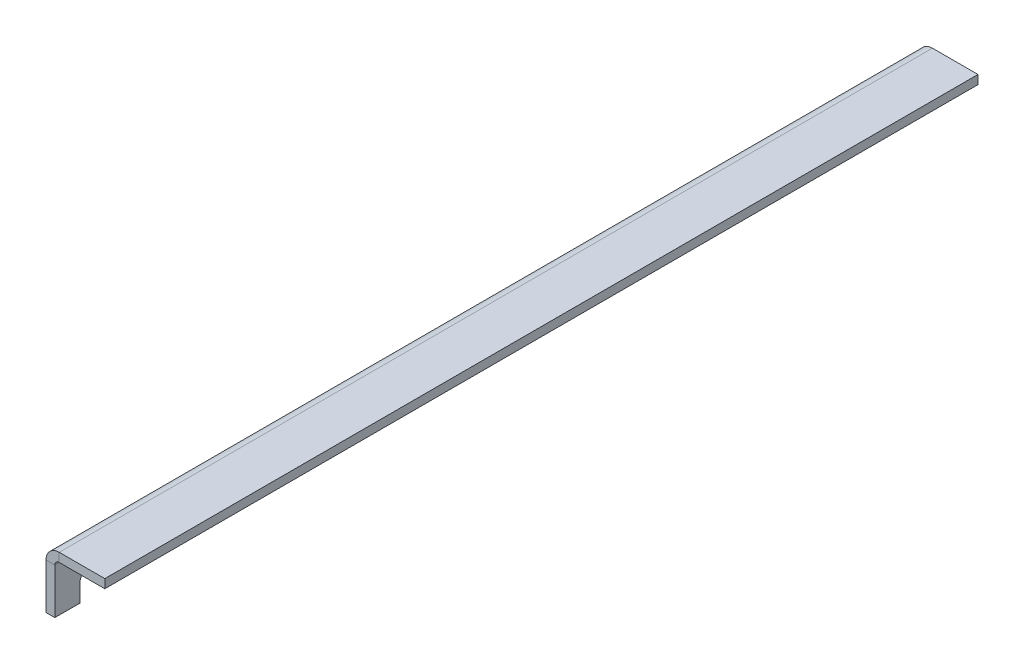
ISO-10303-21;
HEADER;
FILE_DESCRIPTION(('STEP AP214'),'2;1');
FILE_NAME('part.step','',(''),(''),'','','');
FILE_SCHEMA(('AUTOMOTIVE_DESIGN { 1 0 10303 214 1 1 1 1 }'));
ENDSEC;
DATA;
#1=APPLICATION_CONTEXT('core data for automotive mechanical design processes');
#2=APPLICATION_PROTOCOL_DEFINITION('international standard','automotive_design',2000,#1);
#3=PRODUCT_CONTEXT('',#1,'mechanical');
#4=PRODUCT('Part','Part','',(#3));
#5=PRODUCT_RELATED_PRODUCT_CATEGORY('part','',(#4));
#6=PRODUCT_DEFINITION_FORMATION('','',#4);
#7=PRODUCT_DEFINITION_CONTEXT('part definition',#1,'design');
#8=PRODUCT_DEFINITION('design','',#6,#7);
#9=PRODUCT_DEFINITION_SHAPE('','',#8);
#10=(LENGTH_UNIT() NAMED_UNIT(*) SI_UNIT(.MILLI.,.METRE.));
#11=(NAMED_UNIT(*) PLANE_ANGLE_UNIT() SI_UNIT($,.RADIAN.));
#12=(NAMED_UNIT(*) SI_UNIT($,.STERADIAN.) SOLID_ANGLE_UNIT());
#13=UNCERTAINTY_MEASURE_WITH_UNIT(LENGTH_MEASURE(1.E-05),#10,'distance_accuracy_value','');
#14=(GEOMETRIC_REPRESENTATION_CONTEXT(3) GLOBAL_UNCERTAINTY_ASSIGNED_CONTEXT((#13)) GLOBAL_UNIT_ASSIGNED_CONTEXT((#10,
#11,#12)) REPRESENTATION_CONTEXT('',''));
#15=CARTESIAN_POINT('',(0.,0.,0.));
#16=DIRECTION('',(0.,0.,1.));
#17=DIRECTION('',(1.,0.,0.));
#18=AXIS2_PLACEMENT_3D('',#15,#16,#17);
#19=CARTESIAN_POINT('',(2.99999999999994,-20.,148.5));
#20=DIRECTION('',(0.,-1.,0.));
#21=DIRECTION('',(1.,0.,0.));
#22=AXIS2_PLACEMENT_3D('',#19,#20,#21);
#23=PLANE('',#22);
#24=DIRECTION('',(-1.,0.,0.));
#25=VECTOR('',#24,1.);
#26=CARTESIAN_POINT('',(2.99999999999994,-20.,140.));
#27=LINE('',#26,#25);
#28=CARTESIAN_POINT('',(2.99999999999994,-20.,140.));
#29=VERTEX_POINT('',#28);
#30=CARTESIAN_POINT('',(-1.11022302462516E-13,-20.,140.));
#31=VERTEX_POINT('',#30);
#32=EDGE_CURVE('E243',#29,#31,#27,.T.);
#33=ORIENTED_EDGE('',*,*,#32,.F.);
#34=DIRECTION('',(0.,0.,-1.));
#35=VECTOR('',#34,1.);
#36=CARTESIAN_POINT('',(2.99999999999994,-20.,148.5));
#37=LINE('',#36,#35);
#38=CARTESIAN_POINT('',(2.99999999999994,-20.,148.5));
#39=VERTEX_POINT('',#38);
#40=EDGE_CURVE('E272',#39,#29,#37,.T.);
#41=ORIENTED_EDGE('',*,*,#40,.F.);
#42=DIRECTION('',(-1.,0.,0.));
#43=VECTOR('',#42,1.);
#44=CARTESIAN_POINT('',(2.99999999999994,-20.,148.5));
#45=LINE('',#44,#43);
#46=CARTESIAN_POINT('',(0.,-20.,148.5));
#47=VERTEX_POINT('',#46);
#48=EDGE_CURVE('E259',#39,#47,#45,.T.);
#49=ORIENTED_EDGE('',*,*,#48,.T.);
#50=DIRECTION('',(0.,0.,-1.));
#51=VECTOR('',#50,1.);
#52=CARTESIAN_POINT('',(0.,-20.,148.5));
#53=LINE('',#52,#51);
#54=EDGE_CURVE('E276',#47,#31,#53,.T.);
#55=ORIENTED_EDGE('',*,*,#54,.T.);
#56=EDGE_LOOP('',(#33,#41,#49,#55));
#57=FACE_BOUND('',#56,.T.);
#58=ADVANCED_FACE('F39',(#57),#23,.T.);
#59=CARTESIAN_POINT('',(4.49999999999999,0.,148.5));
#60=DIRECTION('',(0.,0.,1.));
#61=DIRECTION('',(1.,0.,0.));
#62=AXIS2_PLACEMENT_3D('',#59,#60,#61);
#63=PLANE('',#62);
#64=DIRECTION('',(0.,-1.,0.));
#65=VECTOR('',#64,1.);
#66=CARTESIAN_POINT('',(4.49999999999999,0.,148.5));
#67=LINE('',#66,#65);
#68=CARTESIAN_POINT('',(4.49999999999999,0.,148.5));
#69=VERTEX_POINT('',#68);
#70=CARTESIAN_POINT('',(4.49999999999999,-3.,148.5));
#71=VERTEX_POINT('',#70);
#72=EDGE_CURVE('E47',#69,#71,#67,.T.);
#73=ORIENTED_EDGE('',*,*,#72,.F.);
#74=CARTESIAN_POINT('',(4.49999999999999,-4.5,148.5));
#75=DIRECTION('',(0.,0.,1.));
#76=DIRECTION('',(1.,0.,0.));
#77=AXIS2_PLACEMENT_3D('',#74,#75,#76);
#78=CIRCLE('',#77,4.5);
#79=CARTESIAN_POINT('',(0.,-4.49999999999999,148.5));
#80=VERTEX_POINT('',#79);
#81=EDGE_CURVE('E253',#80,#69,#78,.F.);
#82=ORIENTED_EDGE('',*,*,#81,.F.);
#83=DIRECTION('',(-1.,0.,0.));
#84=VECTOR('',#83,1.);
#85=CARTESIAN_POINT('',(2.99999999999999,-4.5,148.5));
#86=LINE('',#85,#84);
#87=CARTESIAN_POINT('',(2.99999999999999,-4.5,148.5));
#88=VERTEX_POINT('',#87);
#89=EDGE_CURVE('E287',#88,#80,#86,.T.);
#90=ORIENTED_EDGE('',*,*,#89,.F.);
#91=CARTESIAN_POINT('',(4.49999999999999,-4.5,148.5));
#92=DIRECTION('',(0.,0.,1.));
#93=DIRECTION('',(1.,0.,0.));
#94=AXIS2_PLACEMENT_3D('',#91,#92,#93);
#95=CIRCLE('',#94,1.5);
#96=EDGE_CURVE('E265',#88,#71,#95,.F.);
#97=ORIENTED_EDGE('',*,*,#96,.T.);
#98=EDGE_LOOP('',(#73,#82,#90,#97));
#99=FACE_BOUND('',#98,.T.);
#100=ADVANCED_FACE('F41',(#99),#63,.T.);
#101=CARTESIAN_POINT('',(2.99999999999999,-4.5,148.5));
#102=DIRECTION('',(0.,0.,1.));
#103=DIRECTION('',(1.,0.,0.));
#104=AXIS2_PLACEMENT_3D('',#101,#102,#103);
#105=PLANE('',#104);
#106=DIRECTION('',(1.,0.,0.));
#107=VECTOR('',#106,1.);
#108=CARTESIAN_POINT('',(0.,0.,148.5));
#109=LINE('',#108,#107);
#110=CARTESIAN_POINT('',(20.,0.,148.5));
#111=VERTEX_POINT('',#110);
#112=EDGE_CURVE('E250',#69,#111,#109,.T.);
#113=ORIENTED_EDGE('',*,*,#112,.F.);
#114=ORIENTED_EDGE('',*,*,#72,.T.);
#115=DIRECTION('',(1.,0.,0.));
#116=VECTOR('',#115,1.);
#117=CARTESIAN_POINT('',(0.,-3.,148.5));
#118=LINE('',#117,#116);
#119=CARTESIAN_POINT('',(20.,-3.,148.5));
#120=VERTEX_POINT('',#119);
#121=EDGE_CURVE('E245',#71,#120,#118,.T.);
#122=ORIENTED_EDGE('',*,*,#121,.T.);
#123=DIRECTION('',(0.,-1.,0.));
#124=VECTOR('',#123,1.);
#125=CARTESIAN_POINT('',(20.,0.,148.5));
#126=LINE('',#125,#124);
#127=EDGE_CURVE('E247',#111,#120,#126,.T.);
#128=ORIENTED_EDGE('',*,*,#127,.F.);
#129=EDGE_LOOP('',(#113,#114,#122,#128));
#130=FACE_BOUND('',#129,.T.);
#131=ADVANCED_FACE('F320',(#130),#105,.T.);
#132=CARTESIAN_POINT('',(0.,-3.,148.5));
#133=DIRECTION('',(0.,1.,0.));
#134=DIRECTION('',(-1.,0.,0.));
#135=AXIS2_PLACEMENT_3D('',#132,#133,#134);
#136=PLANE('',#135);
#137=DIRECTION('',(0.,0.,-1.));
#138=VECTOR('',#137,1.);
#139=CARTESIAN_POINT('',(4.49999999999999,-3.,148.5));
#140=LINE('',#139,#138);
#141=CARTESIAN_POINT('',(4.49999999999999,-3.,-148.5));
#142=VERTEX_POINT('',#141);
#143=EDGE_CURVE('E267',#71,#142,#140,.T.);
#144=ORIENTED_EDGE('',*,*,#143,.T.);
#145=DIRECTION('',(1.,0.,0.));
#146=VECTOR('',#145,1.);
#147=CARTESIAN_POINT('',(0.,-3.,-148.5));
#148=LINE('',#147,#146);
#149=CARTESIAN_POINT('',(20.,-3.,-148.5));
#150=VERTEX_POINT('',#149);
#151=EDGE_CURVE('E187',#142,#150,#148,.T.);
#152=ORIENTED_EDGE('',*,*,#151,.T.);
#153=DIRECTION('',(0.,0.,-1.));
#154=VECTOR('',#153,1.);
#155=CARTESIAN_POINT('',(20.,-3.,148.5));
#156=LINE('',#155,#154);
#157=EDGE_CURVE('E285',#120,#150,#156,.T.);
#158=ORIENTED_EDGE('',*,*,#157,.F.);
#159=ORIENTED_EDGE('',*,*,#121,.F.);
#160=EDGE_LOOP('',(#144,#152,#158,#159));
#161=FACE_BOUND('',#160,.T.);
#162=ADVANCED_FACE('F318',(#161),#136,.F.);
#163=CARTESIAN_POINT('',(20.,0.,148.5));
#164=DIRECTION('',(1.,0.,0.));
#165=DIRECTION('',(0.,0.,-1.));
#166=AXIS2_PLACEMENT_3D('',#163,#164,#165);
#167=PLANE('',#166);
#168=ORIENTED_EDGE('',*,*,#157,.T.);
#169=DIRECTION('',(0.,-1.,0.));
#170=VECTOR('',#169,1.);
#171=CARTESIAN_POINT('',(20.,0.,-148.5));
#172=LINE('',#171,#170);
#173=CARTESIAN_POINT('',(20.,0.,-148.5));
#174=VERTEX_POINT('',#173);
#175=EDGE_CURVE('E190',#174,#150,#172,.T.);
#176=ORIENTED_EDGE('',*,*,#175,.F.);
#177=DIRECTION('',(0.,0.,-1.));
#178=VECTOR('',#177,1.);
#179=CARTESIAN_POINT('',(20.,0.,148.5));
#180=LINE('',#179,#178);
#181=EDGE_CURVE('E283',#111,#174,#180,.T.);
#182=ORIENTED_EDGE('',*,*,#181,.F.);
#183=ORIENTED_EDGE('',*,*,#127,.T.);
#184=EDGE_LOOP('',(#168,#176,#182,#183));
#185=FACE_BOUND('',#184,.T.);
#186=ADVANCED_FACE('F331',(#185),#167,.T.);
#187=CARTESIAN_POINT('',(0.,0.,148.5));
#188=DIRECTION('',(0.,1.,0.));
#189=DIRECTION('',(-1.,0.,0.));
#190=AXIS2_PLACEMENT_3D('',#187,#188,#189);
#191=PLANE('',#190);
#192=ORIENTED_EDGE('',*,*,#181,.T.);
#193=DIRECTION('',(1.,0.,0.));
#194=VECTOR('',#193,1.);
#195=CARTESIAN_POINT('',(0.,0.,-148.5));
#196=LINE('',#195,#194);
#197=CARTESIAN_POINT('',(4.49999999999999,0.,-148.5));
#198=VERTEX_POINT('',#197);
#199=EDGE_CURVE('E193',#198,#174,#196,.T.);
#200=ORIENTED_EDGE('',*,*,#199,.F.);
#201=DIRECTION('',(0.,0.,-1.));
#202=VECTOR('',#201,1.);
#203=CARTESIAN_POINT('',(4.49999999999999,0.,148.5));
#204=LINE('',#203,#202);
#205=EDGE_CURVE('E281',#69,#198,#204,.T.);
#206=ORIENTED_EDGE('',*,*,#205,.F.);
#207=ORIENTED_EDGE('',*,*,#112,.T.);
#208=EDGE_LOOP('',(#192,#200,#206,#207));
#209=FACE_BOUND('',#208,.T.);
#210=ADVANCED_FACE('F323',(#209),#191,.T.);
#211=CARTESIAN_POINT('',(4.49999999999999,-4.5,148.5));
#212=DIRECTION('',(0.,0.,-1.));
#213=DIRECTION('',(-1.,0.,0.));
#214=AXIS2_PLACEMENT_3D('',#211,#212,#213);
#215=CYLINDRICAL_SURFACE('',#214,4.5);
#216=ORIENTED_EDGE('',*,*,#205,.T.);
#217=CARTESIAN_POINT('',(4.49999999999999,-4.5,-148.5));
#218=DIRECTION('',(0.,0.,1.));
#219=DIRECTION('',(1.,0.,0.));
#220=AXIS2_PLACEMENT_3D('',#217,#218,#219);
#221=CIRCLE('',#220,4.5);
#222=CARTESIAN_POINT('',(0.,-4.49999999999999,-148.5));
#223=VERTEX_POINT('',#222);
#224=EDGE_CURVE('E196',#223,#198,#221,.F.);
#225=ORIENTED_EDGE('',*,*,#224,.F.);
#226=DIRECTION('',(0.,0.,-1.));
#227=VECTOR('',#226,1.);
#228=CARTESIAN_POINT('',(0.,-4.49999999999999,148.5));
#229=LINE('',#228,#227);
#230=EDGE_CURVE('E279',#80,#223,#229,.T.);
#231=ORIENTED_EDGE('',*,*,#230,.F.);
#232=ORIENTED_EDGE('',*,*,#81,.T.);
#233=EDGE_LOOP('',(#216,#225,#231,#232));
#234=FACE_BOUND('',#233,.T.);
#235=ADVANCED_FACE('F299',(#234),#215,.T.);
#236=CARTESIAN_POINT('',(0.,-20.,148.5));
#237=DIRECTION('',(-1.,0.,0.));
#238=DIRECTION('',(0.,-1.,0.));
#239=AXIS2_PLACEMENT_3D('',#236,#237,#238);
#240=PLANE('',#239);
#241=DIRECTION('',(0.,-1.,0.));
#242=VECTOR('',#241,1.);
#243=CARTESIAN_POINT('',(-1.26201132877313E-13,-25.5000000000001,140.));
#244=LINE('',#243,#242);
#245=CARTESIAN_POINT('',(0.,-14.5,140.));
#246=VERTEX_POINT('',#245);
#247=EDGE_CURVE('E232',#246,#31,#244,.T.);
#248=ORIENTED_EDGE('',*,*,#247,.T.);
#249=ORIENTED_EDGE('',*,*,#54,.F.);
#250=DIRECTION('',(0.,1.,0.));
#251=VECTOR('',#250,1.);
#252=CARTESIAN_POINT('',(0.,-20.,148.5));
#253=LINE('',#252,#251);
#254=EDGE_CURVE('E256',#47,#80,#253,.T.);
#255=ORIENTED_EDGE('',*,*,#254,.T.);
#256=ORIENTED_EDGE('',*,*,#230,.T.);
#257=DIRECTION('',(0.,1.,0.));
#258=VECTOR('',#257,1.);
#259=CARTESIAN_POINT('',(0.,-20.,-148.5));
#260=LINE('',#259,#258);
#261=CARTESIAN_POINT('',(0.,-20.,-148.5));
#262=VERTEX_POINT('',#261);
#263=EDGE_CURVE('E199',#262,#223,#260,.T.);
#264=ORIENTED_EDGE('',*,*,#263,.F.);
#265=DIRECTION('',(0.,0.,1.));
#266=VECTOR('',#265,1.);
#267=CARTESIAN_POINT('',(0.,-20.,-148.5));
#268=LINE('',#267,#266);
#269=CARTESIAN_POINT('',(-1.11022302462516E-13,-20.,-140.));
#270=VERTEX_POINT('',#269);
#271=EDGE_CURVE('E214',#262,#270,#268,.T.);
#272=ORIENTED_EDGE('',*,*,#271,.T.);
#273=DIRECTION('',(0.,-1.,0.));
#274=VECTOR('',#273,1.);
#275=CARTESIAN_POINT('',(-1.26201132877313E-13,-25.5000000000001,-140.));
#276=LINE('',#275,#274);
#277=CARTESIAN_POINT('',(0.,-14.5,-140.));
#278=VERTEX_POINT('',#277);
#279=EDGE_CURVE('E162',#278,#270,#276,.T.);
#280=ORIENTED_EDGE('',*,*,#279,.F.);
#281=CARTESIAN_POINT('',(0.,-14.5,-135.));
#282=DIRECTION('',(-1.,0.,0.));
#283=DIRECTION('',(0.,1.,0.));
#284=AXIS2_PLACEMENT_3D('',#281,#282,#283);
#285=CIRCLE('',#284,5.);
#286=CARTESIAN_POINT('',(0.,-14.5,-130.));
#287=VERTEX_POINT('',#286);
#288=EDGE_CURVE('E154',#287,#278,#285,.T.);
#289=ORIENTED_EDGE('',*,*,#288,.F.);
#290=DIRECTION('',(0.,1.,0.));
#291=VECTOR('',#290,1.);
#292=CARTESIAN_POINT('',(-1.26201132877313E-13,-25.5000000000001,-130.));
#293=LINE('',#292,#291);
#294=CARTESIAN_POINT('',(-1.11022302462516E-13,-20.,-130.));
#295=VERTEX_POINT('',#294);
#296=EDGE_CURVE('E166',#295,#287,#293,.T.);
#297=ORIENTED_EDGE('',*,*,#296,.F.);
#298=CARTESIAN_POINT('',(-1.11022302462516E-13,-20.,130.));
#299=VERTEX_POINT('',#298);
#300=EDGE_CURVE('E275',#299,#295,#53,.T.);
#301=ORIENTED_EDGE('',*,*,#300,.F.);
#302=DIRECTION('',(0.,1.,0.));
#303=VECTOR('',#302,1.);
#304=CARTESIAN_POINT('',(-1.26201132877313E-13,-25.5000000000001,130.));
#305=LINE('',#304,#303);
#306=CARTESIAN_POINT('',(0.,-14.5,130.));
#307=VERTEX_POINT('',#306);
#308=EDGE_CURVE('E225',#299,#307,#305,.T.);
#309=ORIENTED_EDGE('',*,*,#308,.T.);
#310=CARTESIAN_POINT('',(0.,-14.5,135.));
#311=DIRECTION('',(1.,0.,0.));
#312=DIRECTION('',(0.,1.,0.));
#313=AXIS2_PLACEMENT_3D('',#310,#311,#312);
#314=CIRCLE('',#313,5.);
#315=EDGE_CURVE('E228',#307,#246,#314,.T.);
#316=ORIENTED_EDGE('',*,*,#315,.T.);
#317=EDGE_LOOP('',(#248,#249,#255,#256,#264,#272,#280,#289,#297,#301,#309,#316));
#318=FACE_BOUND('',#317,.T.);
#319=ADVANCED_FACE('F175',(#318),#240,.T.);
#320=DIRECTION('',(1.,0.,0.));
#321=VECTOR('',#320,1.);
#322=CARTESIAN_POINT('',(2.99999999999994,-20.,130.));
#323=LINE('',#322,#321);
#324=CARTESIAN_POINT('',(2.99999999999994,-20.,130.));
#325=VERTEX_POINT('',#324);
#326=EDGE_CURVE('E54',#299,#325,#323,.T.);
#327=ORIENTED_EDGE('',*,*,#326,.F.);
#328=ORIENTED_EDGE('',*,*,#300,.T.);
#329=DIRECTION('',(1.,0.,0.));
#330=VECTOR('',#329,1.);
#331=CARTESIAN_POINT('',(2.99999999999994,-20.,-130.));
#332=LINE('',#331,#330);
#333=CARTESIAN_POINT('',(2.99999999999994,-20.,-130.));
#334=VERTEX_POINT('',#333);
#335=EDGE_CURVE('E169',#295,#334,#332,.T.);
#336=ORIENTED_EDGE('',*,*,#335,.T.);
#337=EDGE_CURVE('E271',#325,#334,#37,.T.);
#338=ORIENTED_EDGE('',*,*,#337,.F.);
#339=EDGE_LOOP('',(#327,#328,#336,#338));
#340=FACE_BOUND('',#339,.T.);
#341=ADVANCED_FACE('F342',(#340),#23,.T.);
#342=CARTESIAN_POINT('',(2.99999999999994,-20.,148.5));
#343=DIRECTION('',(-1.,0.,0.));
#344=DIRECTION('',(0.,-1.,0.));
#345=AXIS2_PLACEMENT_3D('',#342,#343,#344);
#346=PLANE('',#345);
#347=ORIENTED_EDGE('',*,*,#40,.T.);
#348=DIRECTION('',(0.,-1.,0.));
#349=VECTOR('',#348,1.);
#350=CARTESIAN_POINT('',(2.99999999999993,-25.5000000000001,140.));
#351=LINE('',#350,#349);
#352=CARTESIAN_POINT('',(2.99999999999996,-14.5,140.));
#353=VERTEX_POINT('',#352);
#354=EDGE_CURVE('E229',#353,#29,#351,.T.);
#355=ORIENTED_EDGE('',*,*,#354,.F.);
#356=CARTESIAN_POINT('',(2.99999999999996,-14.5,135.));
#357=DIRECTION('',(1.,0.,0.));
#358=DIRECTION('',(0.,1.,0.));
#359=AXIS2_PLACEMENT_3D('',#356,#357,#358);
#360=CIRCLE('',#359,5.);
#361=CARTESIAN_POINT('',(2.99999999999996,-14.5,130.));
#362=VERTEX_POINT('',#361);
#363=EDGE_CURVE('E224',#362,#353,#360,.T.);
#364=ORIENTED_EDGE('',*,*,#363,.F.);
#365=DIRECTION('',(0.,-1.,0.));
#366=VECTOR('',#365,1.);
#367=CARTESIAN_POINT('',(2.99999999999994,-20.,130.));
#368=LINE('',#367,#366);
#369=EDGE_CURVE('E11',#362,#325,#368,.T.);
#370=ORIENTED_EDGE('',*,*,#369,.T.);
#371=ORIENTED_EDGE('',*,*,#337,.T.);
#372=DIRECTION('',(0.,-1.,0.));
#373=VECTOR('',#372,1.);
#374=CARTESIAN_POINT('',(2.99999999999994,-20.,-130.));
#375=LINE('',#374,#373);
#376=CARTESIAN_POINT('',(2.99999999999996,-14.5,-130.));
#377=VERTEX_POINT('',#376);
#378=EDGE_CURVE('E222',#377,#334,#375,.T.);
#379=ORIENTED_EDGE('',*,*,#378,.F.);
#380=CARTESIAN_POINT('',(2.99999999999996,-14.5,-135.));
#381=DIRECTION('',(-1.,0.,0.));
#382=DIRECTION('',(0.,1.,0.));
#383=AXIS2_PLACEMENT_3D('',#380,#381,#382);
#384=CIRCLE('',#383,5.);
#385=CARTESIAN_POINT('',(2.99999999999996,-14.5,-140.));
#386=VERTEX_POINT('',#385);
#387=EDGE_CURVE('E157',#377,#386,#384,.T.);
#388=ORIENTED_EDGE('',*,*,#387,.T.);
#389=DIRECTION('',(0.,-1.,0.));
#390=VECTOR('',#389,1.);
#391=CARTESIAN_POINT('',(2.99999999999993,-25.5000000000001,-140.));
#392=LINE('',#391,#390);
#393=CARTESIAN_POINT('',(2.99999999999994,-20.,-140.));
#394=VERTEX_POINT('',#393);
#395=EDGE_CURVE('E172',#386,#394,#392,.T.);
#396=ORIENTED_EDGE('',*,*,#395,.T.);
#397=DIRECTION('',(0.,0.,1.));
#398=VECTOR('',#397,1.);
#399=CARTESIAN_POINT('',(2.99999999999994,-20.,-148.5));
#400=LINE('',#399,#398);
#401=CARTESIAN_POINT('',(2.99999999999994,-20.,-148.5));
#402=VERTEX_POINT('',#401);
#403=EDGE_CURVE('E211',#402,#394,#400,.T.);
#404=ORIENTED_EDGE('',*,*,#403,.F.);
#405=DIRECTION('',(0.,1.,0.));
#406=VECTOR('',#405,1.);
#407=CARTESIAN_POINT('',(2.99999999999994,-20.,-148.5));
#408=LINE('',#407,#406);
#409=CARTESIAN_POINT('',(2.99999999999999,-4.5,-148.5));
#410=VERTEX_POINT('',#409);
#411=EDGE_CURVE('E205',#402,#410,#408,.T.);
#412=ORIENTED_EDGE('',*,*,#411,.T.);
#413=DIRECTION('',(0.,0.,-1.));
#414=VECTOR('',#413,1.);
#415=CARTESIAN_POINT('',(2.99999999999999,-4.5,148.5));
#416=LINE('',#415,#414);
#417=EDGE_CURVE('E269',#88,#410,#416,.T.);
#418=ORIENTED_EDGE('',*,*,#417,.F.);
#419=DIRECTION('',(0.,1.,0.));
#420=VECTOR('',#419,1.);
#421=CARTESIAN_POINT('',(2.99999999999994,-20.,148.5));
#422=LINE('',#421,#420);
#423=EDGE_CURVE('E262',#39,#88,#422,.T.);
#424=ORIENTED_EDGE('',*,*,#423,.F.);
#425=EDGE_LOOP('',(#347,#355,#364,#370,#371,#379,#388,#396,#404,#412,#418,#424));
#426=FACE_BOUND('',#425,.T.);
#427=ADVANCED_FACE('F306',(#426),#346,.F.);
#428=CARTESIAN_POINT('',(4.49999999999999,-4.5,148.5));
#429=DIRECTION('',(0.,0.,-1.));
#430=DIRECTION('',(-1.,0.,0.));
#431=AXIS2_PLACEMENT_3D('',#428,#429,#430);
#432=CYLINDRICAL_SURFACE('',#431,1.5);
#433=ORIENTED_EDGE('',*,*,#417,.T.);
#434=CARTESIAN_POINT('',(4.49999999999999,-4.5,-148.5));
#435=DIRECTION('',(0.,0.,1.));
#436=DIRECTION('',(1.,0.,0.));
#437=AXIS2_PLACEMENT_3D('',#434,#435,#436);
#438=CIRCLE('',#437,1.5);
#439=EDGE_CURVE('E208',#410,#142,#438,.F.);
#440=ORIENTED_EDGE('',*,*,#439,.T.);
#441=ORIENTED_EDGE('',*,*,#143,.F.);
#442=ORIENTED_EDGE('',*,*,#96,.F.);
#443=EDGE_LOOP('',(#433,#440,#441,#442));
#444=FACE_BOUND('',#443,.T.);
#445=ADVANCED_FACE('F312',(#444),#432,.F.);
#446=CARTESIAN_POINT('',(4.49999999999999,-4.5,148.5));
#447=DIRECTION('',(0.,0.,1.));
#448=DIRECTION('',(1.,0.,0.));
#449=AXIS2_PLACEMENT_3D('',#446,#447,#448);
#450=PLANE('',#449);
#451=ORIENTED_EDGE('',*,*,#423,.T.);
#452=ORIENTED_EDGE('',*,*,#89,.T.);
#453=ORIENTED_EDGE('',*,*,#254,.F.);
#454=ORIENTED_EDGE('',*,*,#48,.F.);
#455=EDGE_LOOP('',(#451,#452,#453,#454));
#456=FACE_BOUND('',#455,.T.);
#457=ADVANCED_FACE('F291',(#456),#450,.T.);
#458=CARTESIAN_POINT('',(-1.26201132877313E-13,-25.5000000000001,140.));
#459=DIRECTION('',(0.,0.,1.));
#460=DIRECTION('',(1.,0.,0.));
#461=AXIS2_PLACEMENT_3D('',#458,#459,#460);
#462=PLANE('',#461);
#463=ORIENTED_EDGE('',*,*,#32,.T.);
#464=ORIENTED_EDGE('',*,*,#247,.F.);
#465=DIRECTION('',(1.,0.,0.));
#466=VECTOR('',#465,1.);
#467=CARTESIAN_POINT('',(0.,-14.5,140.));
#468=LINE('',#467,#466);
#469=EDGE_CURVE('E238',#246,#353,#468,.T.);
#470=ORIENTED_EDGE('',*,*,#469,.T.);
#471=ORIENTED_EDGE('',*,*,#354,.T.);
#472=EDGE_LOOP('',(#463,#464,#470,#471));
#473=FACE_BOUND('',#472,.T.);
#474=ADVANCED_FACE('F361',(#473),#462,.F.);
#475=CARTESIAN_POINT('',(0.,-14.5,135.));
#476=DIRECTION('',(1.,0.,0.));
#477=DIRECTION('',(0.,1.,0.));
#478=AXIS2_PLACEMENT_3D('',#475,#476,#477);
#479=CYLINDRICAL_SURFACE('',#478,5.);
#480=ORIENTED_EDGE('',*,*,#363,.T.);
#481=ORIENTED_EDGE('',*,*,#469,.F.);
#482=ORIENTED_EDGE('',*,*,#315,.F.);
#483=DIRECTION('',(1.,0.,0.));
#484=VECTOR('',#483,1.);
#485=CARTESIAN_POINT('',(0.,-14.5,130.));
#486=LINE('',#485,#484);
#487=EDGE_CURVE('E234',#307,#362,#486,.T.);
#488=ORIENTED_EDGE('',*,*,#487,.T.);
#489=EDGE_LOOP('',(#480,#481,#482,#488));
#490=FACE_BOUND('',#489,.T.);
#491=ADVANCED_FACE('F359',(#490),#479,.F.);
#492=CARTESIAN_POINT('',(-1.26201132877313E-13,-25.5000000000001,130.));
#493=DIRECTION('',(0.,0.,-1.));
#494=DIRECTION('',(-1.,0.,0.));
#495=AXIS2_PLACEMENT_3D('',#492,#493,#494);
#496=PLANE('',#495);
#497=ORIENTED_EDGE('',*,*,#326,.T.);
#498=ORIENTED_EDGE('',*,*,#369,.F.);
#499=ORIENTED_EDGE('',*,*,#487,.F.);
#500=ORIENTED_EDGE('',*,*,#308,.F.);
#501=EDGE_LOOP('',(#497,#498,#499,#500));
#502=FACE_BOUND('',#501,.T.);
#503=ADVANCED_FACE('F356',(#502),#496,.F.);
#504=CARTESIAN_POINT('',(2.99999999999994,-20.,-148.5));
#505=DIRECTION('',(0.,-1.,0.));
#506=DIRECTION('',(1.,0.,0.));
#507=AXIS2_PLACEMENT_3D('',#504,#505,#506);
#508=PLANE('',#507);
#509=DIRECTION('',(-1.,0.,0.));
#510=VECTOR('',#509,1.);
#511=CARTESIAN_POINT('',(2.99999999999994,-20.,-140.));
#512=LINE('',#511,#510);
#513=EDGE_CURVE('E184',#394,#270,#512,.T.);
#514=ORIENTED_EDGE('',*,*,#513,.T.);
#515=ORIENTED_EDGE('',*,*,#271,.F.);
#516=DIRECTION('',(-1.,0.,0.));
#517=VECTOR('',#516,1.);
#518=CARTESIAN_POINT('',(2.99999999999994,-20.,-148.5));
#519=LINE('',#518,#517);
#520=EDGE_CURVE('E202',#402,#262,#519,.T.);
#521=ORIENTED_EDGE('',*,*,#520,.F.);
#522=ORIENTED_EDGE('',*,*,#403,.T.);
#523=EDGE_LOOP('',(#514,#515,#521,#522));
#524=FACE_BOUND('',#523,.T.);
#525=ADVANCED_FACE('F367',(#524),#508,.T.);
#526=CARTESIAN_POINT('',(4.49999999999999,0.,-148.5));
#527=DIRECTION('',(0.,0.,-1.));
#528=DIRECTION('',(1.,0.,0.));
#529=AXIS2_PLACEMENT_3D('',#526,#527,#528);
#530=PLANE('',#529);
#531=DIRECTION('',(0.,-1.,0.));
#532=VECTOR('',#531,1.);
#533=CARTESIAN_POINT('',(4.49999999999999,0.,-148.5));
#534=LINE('',#533,#532);
#535=EDGE_CURVE('E219',#198,#142,#534,.T.);
#536=ORIENTED_EDGE('',*,*,#535,.T.);
#537=ORIENTED_EDGE('',*,*,#439,.F.);
#538=DIRECTION('',(-1.,0.,0.));
#539=VECTOR('',#538,1.);
#540=CARTESIAN_POINT('',(2.99999999999999,-4.5,-148.5));
#541=LINE('',#540,#539);
#542=EDGE_CURVE('E216',#410,#223,#541,.T.);
#543=ORIENTED_EDGE('',*,*,#542,.T.);
#544=ORIENTED_EDGE('',*,*,#224,.T.);
#545=EDGE_LOOP('',(#536,#537,#543,#544));
#546=FACE_BOUND('',#545,.T.);
#547=ADVANCED_FACE('F329',(#546),#530,.T.);
#548=CARTESIAN_POINT('',(2.99999999999999,-4.5,-148.5));
#549=DIRECTION('',(0.,0.,-1.));
#550=DIRECTION('',(1.,0.,0.));
#551=AXIS2_PLACEMENT_3D('',#548,#549,#550);
#552=PLANE('',#551);
#553=ORIENTED_EDGE('',*,*,#199,.T.);
#554=ORIENTED_EDGE('',*,*,#175,.T.);
#555=ORIENTED_EDGE('',*,*,#151,.F.);
#556=ORIENTED_EDGE('',*,*,#535,.F.);
#557=EDGE_LOOP('',(#553,#554,#555,#556));
#558=FACE_BOUND('',#557,.T.);
#559=ADVANCED_FACE('F330',(#558),#552,.T.);
#560=CARTESIAN_POINT('',(4.49999999999999,-4.5,-148.5));
#561=DIRECTION('',(0.,0.,-1.));
#562=DIRECTION('',(1.,0.,0.));
#563=AXIS2_PLACEMENT_3D('',#560,#561,#562);
#564=PLANE('',#563);
#565=ORIENTED_EDGE('',*,*,#411,.F.);
#566=ORIENTED_EDGE('',*,*,#520,.T.);
#567=ORIENTED_EDGE('',*,*,#263,.T.);
#568=ORIENTED_EDGE('',*,*,#542,.F.);
#569=EDGE_LOOP('',(#565,#566,#567,#568));
#570=FACE_BOUND('',#569,.T.);
#571=ADVANCED_FACE('F371',(#570),#564,.T.);
#572=CARTESIAN_POINT('',(-1.26201132877313E-13,-25.5000000000001,-140.));
#573=DIRECTION('',(0.,0.,-1.));
#574=DIRECTION('',(1.,0.,0.));
#575=AXIS2_PLACEMENT_3D('',#572,#573,#574);
#576=PLANE('',#575);
#577=ORIENTED_EDGE('',*,*,#513,.F.);
#578=ORIENTED_EDGE('',*,*,#395,.F.);
#579=DIRECTION('',(1.,0.,0.));
#580=VECTOR('',#579,1.);
#581=CARTESIAN_POINT('',(0.,-14.5,-140.));
#582=LINE('',#581,#580);
#583=EDGE_CURVE('E161',#278,#386,#582,.T.);
#584=ORIENTED_EDGE('',*,*,#583,.F.);
#585=ORIENTED_EDGE('',*,*,#279,.T.);
#586=EDGE_LOOP('',(#577,#578,#584,#585));
#587=FACE_BOUND('',#586,.T.);
#588=ADVANCED_FACE('F369',(#587),#576,.F.);
#589=CARTESIAN_POINT('',(0.,-14.5,-135.));
#590=DIRECTION('',(1.,0.,0.));
#591=DIRECTION('',(0.,1.,0.));
#592=AXIS2_PLACEMENT_3D('',#589,#590,#591);
#593=CYLINDRICAL_SURFACE('',#592,5.);
#594=ORIENTED_EDGE('',*,*,#387,.F.);
#595=DIRECTION('',(1.,0.,0.));
#596=VECTOR('',#595,1.);
#597=CARTESIAN_POINT('',(0.,-14.5,-130.));
#598=LINE('',#597,#596);
#599=EDGE_CURVE('E150',#287,#377,#598,.T.);
#600=ORIENTED_EDGE('',*,*,#599,.F.);
#601=ORIENTED_EDGE('',*,*,#288,.T.);
#602=ORIENTED_EDGE('',*,*,#583,.T.);
#603=EDGE_LOOP('',(#594,#600,#601,#602));
#604=FACE_BOUND('',#603,.T.);
#605=ADVANCED_FACE('F152',(#604),#593,.F.);
#606=CARTESIAN_POINT('',(-1.26201132877313E-13,-25.5000000000001,-130.));
#607=DIRECTION('',(0.,0.,1.));
#608=DIRECTION('',(-1.,0.,0.));
#609=AXIS2_PLACEMENT_3D('',#606,#607,#608);
#610=PLANE('',#609);
#611=ORIENTED_EDGE('',*,*,#335,.F.);
#612=ORIENTED_EDGE('',*,*,#296,.T.);
#613=ORIENTED_EDGE('',*,*,#599,.T.);
#614=ORIENTED_EDGE('',*,*,#378,.T.);
#615=EDGE_LOOP('',(#611,#612,#613,#614));
#616=FACE_BOUND('',#615,.T.);
#617=ADVANCED_FACE('F167',(#616),#610,.F.);
#618=CLOSED_SHELL('',(#58,#100,#131,#162,#186,#210,#235,#319,#341,#427,#445,#457,#474,#491,#503,
#525,#547,#559,#571,#588,#605,#617));
#619=MANIFOLD_SOLID_BREP('B2',#618);
#620=ADVANCED_BREP_SHAPE_REPRESENTATION('',(#18,#619),#14);
#621=SHAPE_DEFINITION_REPRESENTATION(#9,#620);
ENDSEC;
END-ISO-10303-21;
